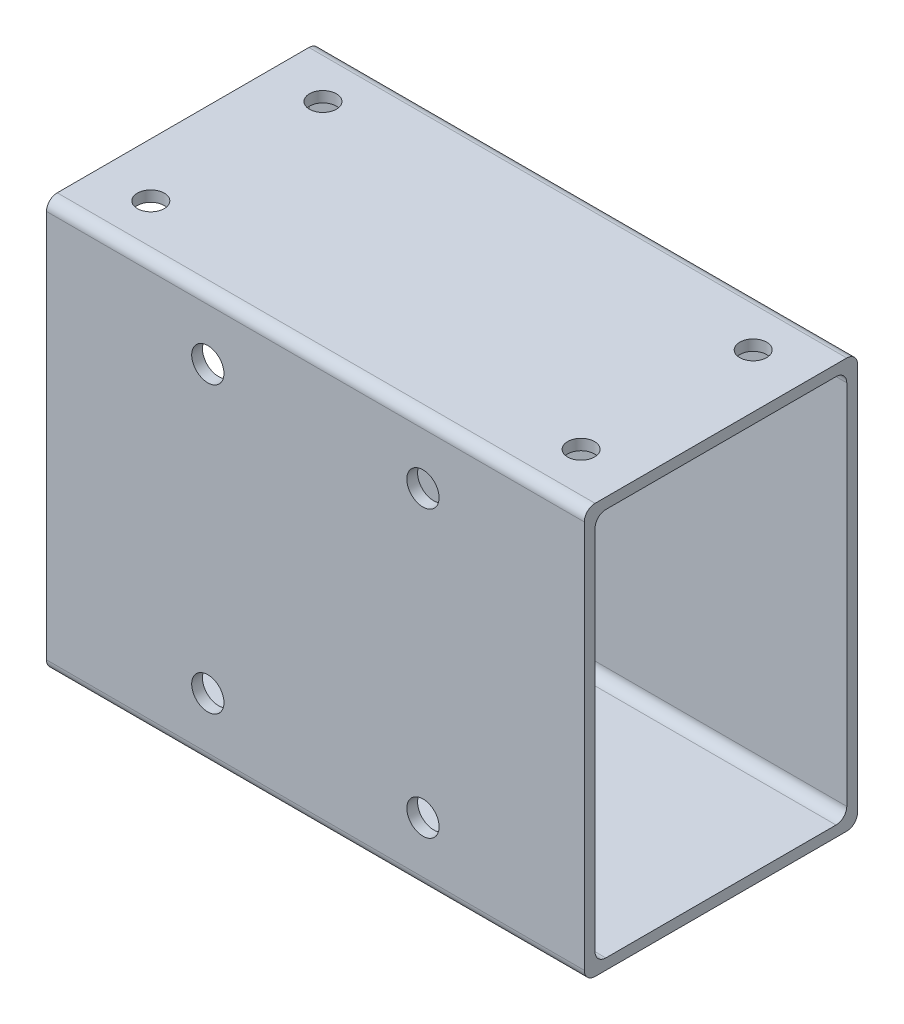
ISO-10303-21;
HEADER;
FILE_DESCRIPTION(('STEP AP214'),'2;1');
FILE_NAME('part.step','',(''),(''),'','','');
FILE_SCHEMA(('AUTOMOTIVE_DESIGN { 1 0 10303 214 1 1 1 1 }'));
ENDSEC;
DATA;
#1=APPLICATION_CONTEXT('core data for automotive mechanical design processes');
#2=APPLICATION_PROTOCOL_DEFINITION('international standard','automotive_design',2000,#1);
#3=PRODUCT_CONTEXT('',#1,'mechanical');
#4=PRODUCT('Part','Part','',(#3));
#5=PRODUCT_RELATED_PRODUCT_CATEGORY('part','',(#4));
#6=PRODUCT_DEFINITION_FORMATION('','',#4);
#7=PRODUCT_DEFINITION_CONTEXT('part definition',#1,'design');
#8=PRODUCT_DEFINITION('design','',#6,#7);
#9=PRODUCT_DEFINITION_SHAPE('','',#8);
#10=(LENGTH_UNIT() NAMED_UNIT(*) SI_UNIT(.MILLI.,.METRE.));
#11=(NAMED_UNIT(*) PLANE_ANGLE_UNIT() SI_UNIT($,.RADIAN.));
#12=(NAMED_UNIT(*) SI_UNIT($,.STERADIAN.) SOLID_ANGLE_UNIT());
#13=UNCERTAINTY_MEASURE_WITH_UNIT(LENGTH_MEASURE(1.E-05),#10,'distance_accuracy_value','');
#14=(GEOMETRIC_REPRESENTATION_CONTEXT(3) GLOBAL_UNCERTAINTY_ASSIGNED_CONTEXT((#13)) GLOBAL_UNIT_ASSIGNED_CONTEXT((#10,
#11,#12)) REPRESENTATION_CONTEXT('',''));
#15=CARTESIAN_POINT('',(0.,0.,0.));
#16=DIRECTION('',(0.,0.,1.));
#17=DIRECTION('',(1.,0.,0.));
#18=AXIS2_PLACEMENT_3D('',#15,#16,#17);
#19=CARTESIAN_POINT('',(-100.,38.1,25.4));
#20=DIRECTION('',(0.,0.,1.));
#21=DIRECTION('',(0.,-1.,0.));
#22=AXIS2_PLACEMENT_3D('',#19,#20,#21);
#23=PLANE('',#22);
#24=CARTESIAN_POINT('',(-30.,-26.5,25.4));
#25=DIRECTION('',(0.,0.,1.));
#26=DIRECTION('',(1.,0.,0.));
#27=AXIS2_PLACEMENT_3D('',#24,#25,#26);
#28=CIRCLE('',#27,3.);
#29=CARTESIAN_POINT('',(-27.,-26.5,25.4));
#30=VERTEX_POINT('',#29);
#31=EDGE_CURVE('E318',#30,#30,#28,.T.);
#32=ORIENTED_EDGE('',*,*,#31,.F.);
#33=EDGE_LOOP('',(#32));
#34=FACE_BOUND('',#33,.T.);
#35=CARTESIAN_POINT('',(-70.,-26.5,25.4));
#36=DIRECTION('',(0.,0.,1.));
#37=DIRECTION('',(1.,0.,0.));
#38=AXIS2_PLACEMENT_3D('',#35,#36,#37);
#39=CIRCLE('',#38,3.00000000000001);
#40=CARTESIAN_POINT('',(-67.,-26.5,25.4));
#41=VERTEX_POINT('',#40);
#42=EDGE_CURVE('E323',#41,#41,#39,.T.);
#43=ORIENTED_EDGE('',*,*,#42,.F.);
#44=EDGE_LOOP('',(#43));
#45=FACE_BOUND('',#44,.T.);
#46=CARTESIAN_POINT('',(-70.,26.5,25.4));
#47=DIRECTION('',(0.,0.,1.));
#48=DIRECTION('',(1.,0.,0.));
#49=AXIS2_PLACEMENT_3D('',#46,#47,#48);
#50=CIRCLE('',#49,3.00000000000001);
#51=CARTESIAN_POINT('',(-67.,26.5,25.4));
#52=VERTEX_POINT('',#51);
#53=EDGE_CURVE('E329',#52,#52,#50,.T.);
#54=ORIENTED_EDGE('',*,*,#53,.F.);
#55=EDGE_LOOP('',(#54));
#56=FACE_BOUND('',#55,.T.);
#57=CARTESIAN_POINT('',(-30.,26.5,25.4));
#58=DIRECTION('',(0.,0.,1.));
#59=DIRECTION('',(1.,0.,0.));
#60=AXIS2_PLACEMENT_3D('',#57,#58,#59);
#61=CIRCLE('',#60,3.);
#62=CARTESIAN_POINT('',(-27.,26.5,25.4));
#63=VERTEX_POINT('',#62);
#64=EDGE_CURVE('E290',#63,#63,#61,.T.);
#65=ORIENTED_EDGE('',*,*,#64,.F.);
#66=EDGE_LOOP('',(#65));
#67=FACE_BOUND('',#66,.T.);
#68=DIRECTION('',(0.,-1.,0.));
#69=VECTOR('',#68,1.);
#70=CARTESIAN_POINT('',(-100.,38.1,25.4));
#71=LINE('',#70,#69);
#72=CARTESIAN_POINT('',(-100.,36.1,25.4));
#73=VERTEX_POINT('',#72);
#74=CARTESIAN_POINT('',(-100.,-36.0999999999999,25.4));
#75=VERTEX_POINT('',#74);
#76=EDGE_CURVE('E367',#73,#75,#71,.T.);
#77=ORIENTED_EDGE('',*,*,#76,.T.);
#78=DIRECTION('',(1.,0.,0.));
#79=VECTOR('',#78,1.);
#80=CARTESIAN_POINT('',(-100.,-36.1,25.4));
#81=LINE('',#80,#79);
#82=CARTESIAN_POINT('',(0.,-36.0999999999999,25.4));
#83=VERTEX_POINT('',#82);
#84=EDGE_CURVE('E228',#75,#83,#81,.T.);
#85=ORIENTED_EDGE('',*,*,#84,.T.);
#86=DIRECTION('',(0.,-1.,0.));
#87=VECTOR('',#86,1.);
#88=CARTESIAN_POINT('',(0.,38.1,25.4));
#89=LINE('',#88,#87);
#90=CARTESIAN_POINT('',(0.,36.1,25.4));
#91=VERTEX_POINT('',#90);
#92=EDGE_CURVE('E166',#91,#83,#89,.T.);
#93=ORIENTED_EDGE('',*,*,#92,.F.);
#94=DIRECTION('',(1.,0.,0.));
#95=VECTOR('',#94,1.);
#96=CARTESIAN_POINT('',(-100.,36.1,25.4));
#97=LINE('',#96,#95);
#98=EDGE_CURVE('E225',#91,#73,#97,.F.);
#99=ORIENTED_EDGE('',*,*,#98,.T.);
#100=EDGE_LOOP('',(#77,#85,#93,#99));
#101=FACE_BOUND('',#100,.T.);
#102=ADVANCED_FACE('F44',(#34,#45,#56,#67,#101),#23,.T.);
#103=CARTESIAN_POINT('',(-100.,38.1,-25.4));
#104=DIRECTION('',(0.,1.,0.));
#105=DIRECTION('',(0.,0.,1.));
#106=AXIS2_PLACEMENT_3D('',#103,#104,#105);
#107=PLANE('',#106);
#108=CARTESIAN_POINT('',(-90.,38.1,16.));
#109=DIRECTION('',(0.,1.,0.));
#110=DIRECTION('',(0.,0.,1.));
#111=AXIS2_PLACEMENT_3D('',#108,#109,#110);
#112=CIRCLE('',#111,2.5);
#113=CARTESIAN_POINT('',(-90.,38.1,18.5));
#114=VERTEX_POINT('',#113);
#115=EDGE_CURVE('E695',#114,#114,#112,.T.);
#116=ORIENTED_EDGE('',*,*,#115,.F.);
#117=EDGE_LOOP('',(#116));
#118=FACE_BOUND('',#117,.T.);
#119=CARTESIAN_POINT('',(-10.,38.1,-16.));
#120=DIRECTION('',(0.,1.,0.));
#121=DIRECTION('',(0.,0.,1.));
#122=AXIS2_PLACEMENT_3D('',#119,#120,#121);
#123=CIRCLE('',#122,2.5);
#124=CARTESIAN_POINT('',(-10.,38.1,-13.5));
#125=VERTEX_POINT('',#124);
#126=EDGE_CURVE('E697',#125,#125,#123,.T.);
#127=ORIENTED_EDGE('',*,*,#126,.F.);
#128=EDGE_LOOP('',(#127));
#129=FACE_BOUND('',#128,.T.);
#130=CARTESIAN_POINT('',(-10.,38.1,16.));
#131=DIRECTION('',(0.,1.,0.));
#132=DIRECTION('',(0.,0.,1.));
#133=AXIS2_PLACEMENT_3D('',#130,#131,#132);
#134=CIRCLE('',#133,2.5);
#135=CARTESIAN_POINT('',(-10.,38.1,18.5));
#136=VERTEX_POINT('',#135);
#137=EDGE_CURVE('E704',#136,#136,#134,.T.);
#138=ORIENTED_EDGE('',*,*,#137,.F.);
#139=EDGE_LOOP('',(#138));
#140=FACE_BOUND('',#139,.T.);
#141=CARTESIAN_POINT('',(-90.,38.1,-16.));
#142=DIRECTION('',(0.,1.,0.));
#143=DIRECTION('',(0.,0.,1.));
#144=AXIS2_PLACEMENT_3D('',#141,#142,#143);
#145=CIRCLE('',#144,2.5);
#146=CARTESIAN_POINT('',(-90.,38.1,-13.5));
#147=VERTEX_POINT('',#146);
#148=EDGE_CURVE('E308',#147,#147,#145,.T.);
#149=ORIENTED_EDGE('',*,*,#148,.F.);
#150=EDGE_LOOP('',(#149));
#151=FACE_BOUND('',#150,.T.);
#152=DIRECTION('',(0.,0.,1.));
#153=VECTOR('',#152,1.);
#154=CARTESIAN_POINT('',(-100.,38.1,-25.4));
#155=LINE('',#154,#153);
#156=CARTESIAN_POINT('',(-100.,38.1,-23.4));
#157=VERTEX_POINT('',#156);
#158=CARTESIAN_POINT('',(-100.,38.1,23.4));
#159=VERTEX_POINT('',#158);
#160=EDGE_CURVE('E190',#157,#159,#155,.T.);
#161=ORIENTED_EDGE('',*,*,#160,.T.);
#162=DIRECTION('',(1.,0.,0.));
#163=VECTOR('',#162,1.);
#164=CARTESIAN_POINT('',(-100.,38.1,23.4));
#165=LINE('',#164,#163);
#166=CARTESIAN_POINT('',(0.,38.1,23.4));
#167=VERTEX_POINT('',#166);
#168=EDGE_CURVE('E233',#159,#167,#165,.T.);
#169=ORIENTED_EDGE('',*,*,#168,.T.);
#170=DIRECTION('',(0.,0.,1.));
#171=VECTOR('',#170,1.);
#172=CARTESIAN_POINT('',(0.,38.1,-25.4));
#173=LINE('',#172,#171);
#174=CARTESIAN_POINT('',(0.,38.1,-23.4));
#175=VERTEX_POINT('',#174);
#176=EDGE_CURVE('E199',#175,#167,#173,.T.);
#177=ORIENTED_EDGE('',*,*,#176,.F.);
#178=DIRECTION('',(1.,0.,0.));
#179=VECTOR('',#178,1.);
#180=CARTESIAN_POINT('',(-100.,38.1,-23.4));
#181=LINE('',#180,#179);
#182=EDGE_CURVE('E69',#175,#157,#181,.F.);
#183=ORIENTED_EDGE('',*,*,#182,.T.);
#184=EDGE_LOOP('',(#161,#169,#177,#183));
#185=FACE_BOUND('',#184,.T.);
#186=ADVANCED_FACE('F383',(#118,#129,#140,#151,#185),#107,.T.);
#187=CARTESIAN_POINT('',(-100.,38.1,-25.4));
#188=DIRECTION('',(0.,0.,-1.));
#189=DIRECTION('',(0.,1.,0.));
#190=AXIS2_PLACEMENT_3D('',#187,#188,#189);
#191=PLANE('',#190);
#192=DIRECTION('',(0.,1.,0.));
#193=VECTOR('',#192,1.);
#194=CARTESIAN_POINT('',(0.,38.1,-25.4));
#195=LINE('',#194,#193);
#196=CARTESIAN_POINT('',(0.,-36.0999999999999,-25.4));
#197=VERTEX_POINT('',#196);
#198=CARTESIAN_POINT('',(0.,36.1,-25.4));
#199=VERTEX_POINT('',#198);
#200=EDGE_CURVE('E184',#197,#199,#195,.T.);
#201=ORIENTED_EDGE('',*,*,#200,.F.);
#202=DIRECTION('',(1.,0.,0.));
#203=VECTOR('',#202,1.);
#204=CARTESIAN_POINT('',(-100.,-36.1,-25.4));
#205=LINE('',#204,#203);
#206=CARTESIAN_POINT('',(-100.,-36.0999999999999,-25.4));
#207=VERTEX_POINT('',#206);
#208=EDGE_CURVE('E212',#197,#207,#205,.F.);
#209=ORIENTED_EDGE('',*,*,#208,.T.);
#210=DIRECTION('',(0.,1.,0.));
#211=VECTOR('',#210,1.);
#212=CARTESIAN_POINT('',(-100.,38.1,-25.4));
#213=LINE('',#212,#211);
#214=CARTESIAN_POINT('',(-100.,36.1,-25.4));
#215=VERTEX_POINT('',#214);
#216=EDGE_CURVE('E196',#207,#215,#213,.T.);
#217=ORIENTED_EDGE('',*,*,#216,.T.);
#218=DIRECTION('',(1.,0.,0.));
#219=VECTOR('',#218,1.);
#220=CARTESIAN_POINT('',(-100.,36.1,-25.4));
#221=LINE('',#220,#219);
#222=EDGE_CURVE('E208',#215,#199,#221,.T.);
#223=ORIENTED_EDGE('',*,*,#222,.T.);
#224=EDGE_LOOP('',(#201,#209,#217,#223));
#225=FACE_BOUND('',#224,.T.);
#226=ADVANCED_FACE('F393',(#225),#191,.T.);
#227=CARTESIAN_POINT('',(-100.,-38.1,-25.4));
#228=DIRECTION('',(0.,-1.,0.));
#229=DIRECTION('',(0.,0.,-1.));
#230=AXIS2_PLACEMENT_3D('',#227,#228,#229);
#231=PLANE('',#230);
#232=DIRECTION('',(0.,0.,-1.));
#233=VECTOR('',#232,1.);
#234=CARTESIAN_POINT('',(-100.,-38.1,-25.4));
#235=LINE('',#234,#233);
#236=CARTESIAN_POINT('',(-100.,-38.1,23.4));
#237=VERTEX_POINT('',#236);
#238=CARTESIAN_POINT('',(-100.,-38.1,-23.4));
#239=VERTEX_POINT('',#238);
#240=EDGE_CURVE('E371',#237,#239,#235,.T.);
#241=ORIENTED_EDGE('',*,*,#240,.T.);
#242=DIRECTION('',(1.,0.,0.));
#243=VECTOR('',#242,1.);
#244=CARTESIAN_POINT('',(-100.,-38.1,-23.4));
#245=LINE('',#244,#243);
#246=CARTESIAN_POINT('',(0.,-38.1,-23.4));
#247=VERTEX_POINT('',#246);
#248=EDGE_CURVE('E182',#239,#247,#245,.T.);
#249=ORIENTED_EDGE('',*,*,#248,.T.);
#250=DIRECTION('',(0.,0.,-1.));
#251=VECTOR('',#250,1.);
#252=CARTESIAN_POINT('',(0.,-38.1,-25.4));
#253=LINE('',#252,#251);
#254=CARTESIAN_POINT('',(0.,-38.1,23.4));
#255=VERTEX_POINT('',#254);
#256=EDGE_CURVE('E164',#255,#247,#253,.T.);
#257=ORIENTED_EDGE('',*,*,#256,.F.);
#258=DIRECTION('',(1.,0.,0.));
#259=VECTOR('',#258,1.);
#260=CARTESIAN_POINT('',(-100.,-38.1,23.4));
#261=LINE('',#260,#259);
#262=EDGE_CURVE('E179',#255,#237,#261,.F.);
#263=ORIENTED_EDGE('',*,*,#262,.T.);
#264=EDGE_LOOP('',(#241,#249,#257,#263));
#265=FACE_BOUND('',#264,.T.);
#266=ADVANCED_FACE('F178',(#265),#231,.T.);
#267=CARTESIAN_POINT('',(-100.,0.,0.));
#268=DIRECTION('',(-1.,0.,0.));
#269=DIRECTION('',(0.,0.,1.));
#270=AXIS2_PLACEMENT_3D('',#267,#268,#269);
#271=PLANE('',#270);
#272=DIRECTION('',(0.,0.,1.));
#273=VECTOR('',#272,1.);
#274=CARTESIAN_POINT('',(-100.,36.1,-23.4));
#275=LINE('',#274,#273);
#276=CARTESIAN_POINT('',(-100.,36.1,-21.4));
#277=VERTEX_POINT('',#276);
#278=CARTESIAN_POINT('',(-100.,36.1,21.4));
#279=VERTEX_POINT('',#278);
#280=EDGE_CURVE('E349',#277,#279,#275,.T.);
#281=ORIENTED_EDGE('',*,*,#280,.T.);
#282=CARTESIAN_POINT('',(-100.,34.1,21.4));
#283=DIRECTION('',(-1.,0.,0.));
#284=DIRECTION('',(0.,0.,1.));
#285=AXIS2_PLACEMENT_3D('',#282,#283,#284);
#286=CIRCLE('',#285,2.);
#287=CARTESIAN_POINT('',(-100.,34.1,23.4));
#288=VERTEX_POINT('',#287);
#289=EDGE_CURVE('E11',#279,#288,#286,.F.);
#290=ORIENTED_EDGE('',*,*,#289,.T.);
#291=DIRECTION('',(0.,-1.,0.));
#292=VECTOR('',#291,1.);
#293=CARTESIAN_POINT('',(-100.,36.1,23.4));
#294=LINE('',#293,#292);
#295=CARTESIAN_POINT('',(-100.,-34.1,23.4));
#296=VERTEX_POINT('',#295);
#297=EDGE_CURVE('E336',#288,#296,#294,.T.);
#298=ORIENTED_EDGE('',*,*,#297,.T.);
#299=CARTESIAN_POINT('',(-100.,-34.1,21.4));
#300=DIRECTION('',(-1.,0.,0.));
#301=DIRECTION('',(0.,0.,1.));
#302=AXIS2_PLACEMENT_3D('',#299,#300,#301);
#303=CIRCLE('',#302,2.);
#304=CARTESIAN_POINT('',(-100.,-36.1,21.4));
#305=VERTEX_POINT('',#304);
#306=EDGE_CURVE('E280',#296,#305,#303,.F.);
#307=ORIENTED_EDGE('',*,*,#306,.T.);
#308=DIRECTION('',(0.,0.,-1.));
#309=VECTOR('',#308,1.);
#310=CARTESIAN_POINT('',(-100.,-36.1,-23.4));
#311=LINE('',#310,#309);
#312=CARTESIAN_POINT('',(-100.,-36.1,-21.4));
#313=VERTEX_POINT('',#312);
#314=EDGE_CURVE('E340',#305,#313,#311,.T.);
#315=ORIENTED_EDGE('',*,*,#314,.T.);
#316=CARTESIAN_POINT('',(-100.,-34.1,-21.4));
#317=DIRECTION('',(-1.,0.,0.));
#318=DIRECTION('',(0.,0.,1.));
#319=AXIS2_PLACEMENT_3D('',#316,#317,#318);
#320=CIRCLE('',#319,2.);
#321=CARTESIAN_POINT('',(-100.,-34.1,-23.4));
#322=VERTEX_POINT('',#321);
#323=EDGE_CURVE('E268',#313,#322,#320,.F.);
#324=ORIENTED_EDGE('',*,*,#323,.T.);
#325=DIRECTION('',(0.,1.,0.));
#326=VECTOR('',#325,1.);
#327=CARTESIAN_POINT('',(-100.,36.1,-23.4));
#328=LINE('',#327,#326);
#329=CARTESIAN_POINT('',(-100.,34.1,-23.4));
#330=VERTEX_POINT('',#329);
#331=EDGE_CURVE('E345',#322,#330,#328,.T.);
#332=ORIENTED_EDGE('',*,*,#331,.T.);
#333=CARTESIAN_POINT('',(-100.,34.1,-21.4));
#334=DIRECTION('',(-1.,0.,0.));
#335=DIRECTION('',(0.,0.,1.));
#336=AXIS2_PLACEMENT_3D('',#333,#334,#335);
#337=CIRCLE('',#336,2.);
#338=EDGE_CURVE('E274',#330,#277,#337,.F.);
#339=ORIENTED_EDGE('',*,*,#338,.T.);
#340=EDGE_LOOP('',(#281,#290,#298,#307,#315,#324,#332,#339));
#341=FACE_BOUND('',#340,.T.);
#342=ORIENTED_EDGE('',*,*,#216,.F.);
#343=CARTESIAN_POINT('',(-100.,-36.1,-23.4));
#344=DIRECTION('',(-1.,0.,0.));
#345=DIRECTION('',(0.,0.,1.));
#346=AXIS2_PLACEMENT_3D('',#343,#344,#345);
#347=CIRCLE('',#346,2.);
#348=EDGE_CURVE('E222',#207,#239,#347,.T.);
#349=ORIENTED_EDGE('',*,*,#348,.T.);
#350=ORIENTED_EDGE('',*,*,#240,.F.);
#351=CARTESIAN_POINT('',(-100.,-36.1,23.4));
#352=DIRECTION('',(-1.,0.,0.));
#353=DIRECTION('',(0.,0.,1.));
#354=AXIS2_PLACEMENT_3D('',#351,#352,#353);
#355=CIRCLE('',#354,2.);
#356=EDGE_CURVE('E188',#237,#75,#355,.T.);
#357=ORIENTED_EDGE('',*,*,#356,.T.);
#358=ORIENTED_EDGE('',*,*,#76,.F.);
#359=CARTESIAN_POINT('',(-100.,36.1,23.4));
#360=DIRECTION('',(-1.,0.,0.));
#361=DIRECTION('',(0.,0.,1.));
#362=AXIS2_PLACEMENT_3D('',#359,#360,#361);
#363=CIRCLE('',#362,2.);
#364=EDGE_CURVE('E62',#73,#159,#363,.T.);
#365=ORIENTED_EDGE('',*,*,#364,.T.);
#366=ORIENTED_EDGE('',*,*,#160,.F.);
#367=CARTESIAN_POINT('',(-100.,36.1,-23.4));
#368=DIRECTION('',(-1.,0.,0.));
#369=DIRECTION('',(0.,0.,1.));
#370=AXIS2_PLACEMENT_3D('',#367,#368,#369);
#371=CIRCLE('',#370,2.);
#372=EDGE_CURVE('E215',#157,#215,#371,.T.);
#373=ORIENTED_EDGE('',*,*,#372,.T.);
#374=EDGE_LOOP('',(#342,#349,#350,#357,#358,#365,#366,#373));
#375=FACE_BOUND('',#374,.T.);
#376=ADVANCED_FACE('F390',(#341,#375),#271,.T.);
#377=CARTESIAN_POINT('',(0.,0.,0.));
#378=DIRECTION('',(-1.,0.,0.));
#379=DIRECTION('',(0.,0.,1.));
#380=AXIS2_PLACEMENT_3D('',#377,#378,#379);
#381=PLANE('',#380);
#382=DIRECTION('',(0.,0.,-1.));
#383=VECTOR('',#382,1.);
#384=CARTESIAN_POINT('',(0.,-36.1,-23.4));
#385=LINE('',#384,#383);
#386=CARTESIAN_POINT('',(0.,-36.1,21.4));
#387=VERTEX_POINT('',#386);
#388=CARTESIAN_POINT('',(0.,-36.1,-21.4));
#389=VERTEX_POINT('',#388);
#390=EDGE_CURVE('E356',#387,#389,#385,.T.);
#391=ORIENTED_EDGE('',*,*,#390,.F.);
#392=CARTESIAN_POINT('',(0.,-34.1,21.4));
#393=DIRECTION('',(-1.,0.,0.));
#394=DIRECTION('',(0.,0.,1.));
#395=AXIS2_PLACEMENT_3D('',#392,#393,#394);
#396=CIRCLE('',#395,2.);
#397=CARTESIAN_POINT('',(0.,-34.1,23.4));
#398=VERTEX_POINT('',#397);
#399=EDGE_CURVE('E277',#387,#398,#396,.T.);
#400=ORIENTED_EDGE('',*,*,#399,.T.);
#401=DIRECTION('',(0.,-1.,0.));
#402=VECTOR('',#401,1.);
#403=CARTESIAN_POINT('',(0.,36.1,23.4));
#404=LINE('',#403,#402);
#405=CARTESIAN_POINT('',(0.,34.1,23.4));
#406=VERTEX_POINT('',#405);
#407=EDGE_CURVE('E302',#406,#398,#404,.T.);
#408=ORIENTED_EDGE('',*,*,#407,.F.);
#409=CARTESIAN_POINT('',(0.,34.1,21.4));
#410=DIRECTION('',(-1.,0.,0.));
#411=DIRECTION('',(0.,0.,1.));
#412=AXIS2_PLACEMENT_3D('',#409,#410,#411);
#413=CIRCLE('',#412,2.);
#414=CARTESIAN_POINT('',(0.,36.1,21.4));
#415=VERTEX_POINT('',#414);
#416=EDGE_CURVE('E54',#406,#415,#413,.T.);
#417=ORIENTED_EDGE('',*,*,#416,.T.);
#418=DIRECTION('',(0.,0.,1.));
#419=VECTOR('',#418,1.);
#420=CARTESIAN_POINT('',(0.,36.1,-23.4));
#421=LINE('',#420,#419);
#422=CARTESIAN_POINT('',(0.,36.1,-21.4));
#423=VERTEX_POINT('',#422);
#424=EDGE_CURVE('E341',#423,#415,#421,.T.);
#425=ORIENTED_EDGE('',*,*,#424,.F.);
#426=CARTESIAN_POINT('',(0.,34.1,-21.4));
#427=DIRECTION('',(-1.,0.,0.));
#428=DIRECTION('',(0.,0.,1.));
#429=AXIS2_PLACEMENT_3D('',#426,#427,#428);
#430=CIRCLE('',#429,2.);
#431=CARTESIAN_POINT('',(0.,34.1,-23.4));
#432=VERTEX_POINT('',#431);
#433=EDGE_CURVE('E271',#423,#432,#430,.T.);
#434=ORIENTED_EDGE('',*,*,#433,.T.);
#435=DIRECTION('',(0.,1.,0.));
#436=VECTOR('',#435,1.);
#437=CARTESIAN_POINT('',(0.,36.1,-23.4));
#438=LINE('',#437,#436);
#439=CARTESIAN_POINT('',(0.,-34.1,-23.4));
#440=VERTEX_POINT('',#439);
#441=EDGE_CURVE('E360',#440,#432,#438,.T.);
#442=ORIENTED_EDGE('',*,*,#441,.F.);
#443=CARTESIAN_POINT('',(0.,-34.1,-21.4));
#444=DIRECTION('',(-1.,0.,0.));
#445=DIRECTION('',(0.,0.,1.));
#446=AXIS2_PLACEMENT_3D('',#443,#444,#445);
#447=CIRCLE('',#446,2.);
#448=EDGE_CURVE('E265',#440,#389,#447,.T.);
#449=ORIENTED_EDGE('',*,*,#448,.T.);
#450=EDGE_LOOP('',(#391,#400,#408,#417,#425,#434,#442,#449));
#451=FACE_BOUND('',#450,.T.);
#452=ORIENTED_EDGE('',*,*,#256,.T.);
#453=CARTESIAN_POINT('',(0.,-36.1,-23.4));
#454=DIRECTION('',(-1.,0.,0.));
#455=DIRECTION('',(0.,0.,1.));
#456=AXIS2_PLACEMENT_3D('',#453,#454,#455);
#457=CIRCLE('',#456,2.);
#458=EDGE_CURVE('E172',#247,#197,#457,.F.);
#459=ORIENTED_EDGE('',*,*,#458,.T.);
#460=ORIENTED_EDGE('',*,*,#200,.T.);
#461=CARTESIAN_POINT('',(0.,36.1,-23.4));
#462=DIRECTION('',(-1.,0.,0.));
#463=DIRECTION('',(0.,0.,1.));
#464=AXIS2_PLACEMENT_3D('',#461,#462,#463);
#465=CIRCLE('',#464,2.);
#466=EDGE_CURVE('E194',#199,#175,#465,.F.);
#467=ORIENTED_EDGE('',*,*,#466,.T.);
#468=ORIENTED_EDGE('',*,*,#176,.T.);
#469=CARTESIAN_POINT('',(0.,36.1,23.4));
#470=DIRECTION('',(-1.,0.,0.));
#471=DIRECTION('',(0.,0.,1.));
#472=AXIS2_PLACEMENT_3D('',#469,#470,#471);
#473=CIRCLE('',#472,2.);
#474=EDGE_CURVE('E173',#167,#91,#473,.F.);
#475=ORIENTED_EDGE('',*,*,#474,.T.);
#476=ORIENTED_EDGE('',*,*,#92,.T.);
#477=CARTESIAN_POINT('',(0.,-36.1,23.4));
#478=DIRECTION('',(-1.,0.,0.));
#479=DIRECTION('',(0.,0.,1.));
#480=AXIS2_PLACEMENT_3D('',#477,#478,#479);
#481=CIRCLE('',#480,2.);
#482=EDGE_CURVE('E161',#83,#255,#481,.F.);
#483=ORIENTED_EDGE('',*,*,#482,.T.);
#484=EDGE_LOOP('',(#452,#459,#460,#467,#468,#475,#476,#483));
#485=FACE_BOUND('',#484,.T.);
#486=ADVANCED_FACE('F163',(#451,#485),#381,.F.);
#487=CARTESIAN_POINT('',(-100.,36.1,23.4));
#488=DIRECTION('',(0.,0.,1.));
#489=DIRECTION('',(1.,0.,0.));
#490=AXIS2_PLACEMENT_3D('',#487,#488,#489);
#491=PLANE('',#490);
#492=CARTESIAN_POINT('',(-30.,-26.5,23.4));
#493=DIRECTION('',(0.,0.,1.));
#494=DIRECTION('',(1.,0.,0.));
#495=AXIS2_PLACEMENT_3D('',#492,#493,#494);
#496=CIRCLE('',#495,3.);
#497=CARTESIAN_POINT('',(-27.,-26.5,23.4));
#498=VERTEX_POINT('',#497);
#499=EDGE_CURVE('E298',#498,#498,#496,.T.);
#500=ORIENTED_EDGE('',*,*,#499,.T.);
#501=EDGE_LOOP('',(#500));
#502=FACE_BOUND('',#501,.T.);
#503=CARTESIAN_POINT('',(-70.,-26.5,23.4));
#504=DIRECTION('',(0.,0.,1.));
#505=DIRECTION('',(1.,0.,0.));
#506=AXIS2_PLACEMENT_3D('',#503,#504,#505);
#507=CIRCLE('',#506,3.00000000000001);
#508=CARTESIAN_POINT('',(-67.,-26.5,23.4));
#509=VERTEX_POINT('',#508);
#510=EDGE_CURVE('E294',#509,#509,#507,.T.);
#511=ORIENTED_EDGE('',*,*,#510,.T.);
#512=EDGE_LOOP('',(#511));
#513=FACE_BOUND('',#512,.T.);
#514=CARTESIAN_POINT('',(-70.,26.5,23.4));
#515=DIRECTION('',(0.,0.,1.));
#516=DIRECTION('',(1.,0.,0.));
#517=AXIS2_PLACEMENT_3D('',#514,#515,#516);
#518=CIRCLE('',#517,3.00000000000001);
#519=CARTESIAN_POINT('',(-67.,26.5,23.4));
#520=VERTEX_POINT('',#519);
#521=EDGE_CURVE('E289',#520,#520,#518,.T.);
#522=ORIENTED_EDGE('',*,*,#521,.T.);
#523=EDGE_LOOP('',(#522));
#524=FACE_BOUND('',#523,.T.);
#525=CARTESIAN_POINT('',(-30.,26.5,23.4));
#526=DIRECTION('',(0.,0.,1.));
#527=DIRECTION('',(1.,0.,0.));
#528=AXIS2_PLACEMENT_3D('',#525,#526,#527);
#529=CIRCLE('',#528,3.);
#530=CARTESIAN_POINT('',(-27.,26.5,23.4));
#531=VERTEX_POINT('',#530);
#532=EDGE_CURVE('E285',#531,#531,#529,.T.);
#533=ORIENTED_EDGE('',*,*,#532,.T.);
#534=EDGE_LOOP('',(#533));
#535=FACE_BOUND('',#534,.T.);
#536=ORIENTED_EDGE('',*,*,#407,.T.);
#537=DIRECTION('',(1.,0.,0.));
#538=VECTOR('',#537,1.);
#539=CARTESIAN_POINT('',(-100.,-34.1,23.4));
#540=LINE('',#539,#538);
#541=EDGE_CURVE('E262',#398,#296,#540,.F.);
#542=ORIENTED_EDGE('',*,*,#541,.T.);
#543=ORIENTED_EDGE('',*,*,#297,.F.);
#544=DIRECTION('',(1.,0.,0.));
#545=VECTOR('',#544,1.);
#546=CARTESIAN_POINT('',(0.,34.1,23.4));
#547=LINE('',#546,#545);
#548=EDGE_CURVE('E258',#288,#406,#547,.T.);
#549=ORIENTED_EDGE('',*,*,#548,.T.);
#550=EDGE_LOOP('',(#536,#542,#543,#549));
#551=FACE_BOUND('',#550,.T.);
#552=ADVANCED_FACE('F438',(#502,#513,#524,#535,#551),#491,.F.);
#553=CARTESIAN_POINT('',(-100.,36.1,-23.4));
#554=DIRECTION('',(0.,1.,0.));
#555=DIRECTION('',(0.,0.,1.));
#556=AXIS2_PLACEMENT_3D('',#553,#554,#555);
#557=PLANE('',#556);
#558=CARTESIAN_POINT('',(-90.,36.1,16.));
#559=DIRECTION('',(0.,1.,0.));
#560=DIRECTION('',(0.,0.,1.));
#561=AXIS2_PLACEMENT_3D('',#558,#559,#560);
#562=CIRCLE('',#561,2.5);
#563=CARTESIAN_POINT('',(-90.,36.1,18.5));
#564=VERTEX_POINT('',#563);
#565=EDGE_CURVE('E48',#564,#564,#562,.T.);
#566=ORIENTED_EDGE('',*,*,#565,.T.);
#567=EDGE_LOOP('',(#566));
#568=FACE_BOUND('',#567,.T.);
#569=CARTESIAN_POINT('',(-10.,36.1,-16.));
#570=DIRECTION('',(0.,1.,0.));
#571=DIRECTION('',(0.,0.,1.));
#572=AXIS2_PLACEMENT_3D('',#569,#570,#571);
#573=CIRCLE('',#572,2.5);
#574=CARTESIAN_POINT('',(-10.,36.1,-13.5));
#575=VERTEX_POINT('',#574);
#576=EDGE_CURVE('E311',#575,#575,#573,.T.);
#577=ORIENTED_EDGE('',*,*,#576,.T.);
#578=EDGE_LOOP('',(#577));
#579=FACE_BOUND('',#578,.T.);
#580=CARTESIAN_POINT('',(-10.,36.1,16.));
#581=DIRECTION('',(0.,1.,0.));
#582=DIRECTION('',(0.,0.,1.));
#583=AXIS2_PLACEMENT_3D('',#580,#581,#582);
#584=CIRCLE('',#583,2.5);
#585=CARTESIAN_POINT('',(-10.,36.1,18.5));
#586=VERTEX_POINT('',#585);
#587=EDGE_CURVE('E307',#586,#586,#584,.T.);
#588=ORIENTED_EDGE('',*,*,#587,.T.);
#589=EDGE_LOOP('',(#588));
#590=FACE_BOUND('',#589,.T.);
#591=CARTESIAN_POINT('',(-90.,36.1,-16.));
#592=DIRECTION('',(0.,1.,0.));
#593=DIRECTION('',(0.,0.,1.));
#594=AXIS2_PLACEMENT_3D('',#591,#592,#593);
#595=CIRCLE('',#594,2.5);
#596=CARTESIAN_POINT('',(-90.,36.1,-13.5));
#597=VERTEX_POINT('',#596);
#598=EDGE_CURVE('E303',#597,#597,#595,.T.);
#599=ORIENTED_EDGE('',*,*,#598,.T.);
#600=EDGE_LOOP('',(#599));
#601=FACE_BOUND('',#600,.T.);
#602=ORIENTED_EDGE('',*,*,#280,.F.);
#603=DIRECTION('',(1.,0.,0.));
#604=VECTOR('',#603,1.);
#605=CARTESIAN_POINT('',(0.,36.1,-21.4));
#606=LINE('',#605,#604);
#607=EDGE_CURVE('E254',#277,#423,#606,.T.);
#608=ORIENTED_EDGE('',*,*,#607,.T.);
#609=ORIENTED_EDGE('',*,*,#424,.T.);
#610=DIRECTION('',(1.,0.,0.));
#611=VECTOR('',#610,1.);
#612=CARTESIAN_POINT('',(-100.,36.1,21.4));
#613=LINE('',#612,#611);
#614=EDGE_CURVE('E251',#415,#279,#613,.F.);
#615=ORIENTED_EDGE('',*,*,#614,.T.);
#616=EDGE_LOOP('',(#602,#608,#609,#615));
#617=FACE_BOUND('',#616,.T.);
#618=ADVANCED_FACE('F433',(#568,#579,#590,#601,#617),#557,.F.);
#619=CARTESIAN_POINT('',(-100.,36.1,-23.4));
#620=DIRECTION('',(0.,0.,-1.));
#621=DIRECTION('',(-1.,0.,0.));
#622=AXIS2_PLACEMENT_3D('',#619,#620,#621);
#623=PLANE('',#622);
#624=ORIENTED_EDGE('',*,*,#331,.F.);
#625=DIRECTION('',(1.,0.,0.));
#626=VECTOR('',#625,1.);
#627=CARTESIAN_POINT('',(0.,-34.1,-23.4));
#628=LINE('',#627,#626);
#629=EDGE_CURVE('E240',#322,#440,#628,.T.);
#630=ORIENTED_EDGE('',*,*,#629,.T.);
#631=ORIENTED_EDGE('',*,*,#441,.T.);
#632=DIRECTION('',(1.,0.,0.));
#633=VECTOR('',#632,1.);
#634=CARTESIAN_POINT('',(-100.,34.1,-23.4));
#635=LINE('',#634,#633);
#636=EDGE_CURVE('E237',#432,#330,#635,.F.);
#637=ORIENTED_EDGE('',*,*,#636,.T.);
#638=EDGE_LOOP('',(#624,#630,#631,#637));
#639=FACE_BOUND('',#638,.T.);
#640=ADVANCED_FACE('F427',(#639),#623,.F.);
#641=CARTESIAN_POINT('',(-100.,-36.1,-23.4));
#642=DIRECTION('',(0.,-1.,0.));
#643=DIRECTION('',(0.,0.,-1.));
#644=AXIS2_PLACEMENT_3D('',#641,#642,#643);
#645=PLANE('',#644);
#646=ORIENTED_EDGE('',*,*,#390,.T.);
#647=DIRECTION('',(1.,0.,0.));
#648=VECTOR('',#647,1.);
#649=CARTESIAN_POINT('',(-100.,-36.1,-21.4));
#650=LINE('',#649,#648);
#651=EDGE_CURVE('E248',#389,#313,#650,.F.);
#652=ORIENTED_EDGE('',*,*,#651,.T.);
#653=ORIENTED_EDGE('',*,*,#314,.F.);
#654=DIRECTION('',(1.,0.,0.));
#655=VECTOR('',#654,1.);
#656=CARTESIAN_POINT('',(0.,-36.1,21.4));
#657=LINE('',#656,#655);
#658=EDGE_CURVE('E244',#305,#387,#657,.T.);
#659=ORIENTED_EDGE('',*,*,#658,.T.);
#660=EDGE_LOOP('',(#646,#652,#653,#659));
#661=FACE_BOUND('',#660,.T.);
#662=ADVANCED_FACE('F423',(#661),#645,.F.);
#663=CARTESIAN_POINT('',(-100.,-36.1,-23.4));
#664=DIRECTION('',(1.,0.,0.));
#665=DIRECTION('',(0.,0.,-1.));
#666=AXIS2_PLACEMENT_3D('',#663,#664,#665);
#667=CYLINDRICAL_SURFACE('',#666,2.);
#668=ORIENTED_EDGE('',*,*,#348,.F.);
#669=ORIENTED_EDGE('',*,*,#208,.F.);
#670=ORIENTED_EDGE('',*,*,#458,.F.);
#671=ORIENTED_EDGE('',*,*,#248,.F.);
#672=EDGE_LOOP('',(#668,#669,#670,#671));
#673=FACE_BOUND('',#672,.T.);
#674=ADVANCED_FACE('F396',(#673),#667,.T.);
#675=CARTESIAN_POINT('',(-100.,-36.1,23.4));
#676=DIRECTION('',(1.,0.,0.));
#677=DIRECTION('',(0.,0.,-1.));
#678=AXIS2_PLACEMENT_3D('',#675,#676,#677);
#679=CYLINDRICAL_SURFACE('',#678,2.);
#680=ORIENTED_EDGE('',*,*,#356,.F.);
#681=ORIENTED_EDGE('',*,*,#262,.F.);
#682=ORIENTED_EDGE('',*,*,#482,.F.);
#683=ORIENTED_EDGE('',*,*,#84,.F.);
#684=EDGE_LOOP('',(#680,#681,#682,#683));
#685=FACE_BOUND('',#684,.T.);
#686=ADVANCED_FACE('F187',(#685),#679,.T.);
#687=CARTESIAN_POINT('',(-100.,36.1,23.4));
#688=DIRECTION('',(1.,0.,0.));
#689=DIRECTION('',(0.,0.,-1.));
#690=AXIS2_PLACEMENT_3D('',#687,#688,#689);
#691=CYLINDRICAL_SURFACE('',#690,2.);
#692=ORIENTED_EDGE('',*,*,#364,.F.);
#693=ORIENTED_EDGE('',*,*,#98,.F.);
#694=ORIENTED_EDGE('',*,*,#474,.F.);
#695=ORIENTED_EDGE('',*,*,#168,.F.);
#696=EDGE_LOOP('',(#692,#693,#694,#695));
#697=FACE_BOUND('',#696,.T.);
#698=ADVANCED_FACE('F400',(#697),#691,.T.);
#699=CARTESIAN_POINT('',(-100.,36.1,-23.4));
#700=DIRECTION('',(1.,0.,0.));
#701=DIRECTION('',(0.,0.,-1.));
#702=AXIS2_PLACEMENT_3D('',#699,#700,#701);
#703=CYLINDRICAL_SURFACE('',#702,2.);
#704=ORIENTED_EDGE('',*,*,#372,.F.);
#705=ORIENTED_EDGE('',*,*,#182,.F.);
#706=ORIENTED_EDGE('',*,*,#466,.F.);
#707=ORIENTED_EDGE('',*,*,#222,.F.);
#708=EDGE_LOOP('',(#704,#705,#706,#707));
#709=FACE_BOUND('',#708,.T.);
#710=ADVANCED_FACE('F387',(#709),#703,.T.);
#711=CARTESIAN_POINT('',(-100.,-34.1,-21.4));
#712=DIRECTION('',(-1.,0.,0.));
#713=DIRECTION('',(0.,0.,1.));
#714=AXIS2_PLACEMENT_3D('',#711,#712,#713);
#715=CYLINDRICAL_SURFACE('',#714,2.);
#716=ORIENTED_EDGE('',*,*,#323,.F.);
#717=ORIENTED_EDGE('',*,*,#651,.F.);
#718=ORIENTED_EDGE('',*,*,#448,.F.);
#719=ORIENTED_EDGE('',*,*,#629,.F.);
#720=EDGE_LOOP('',(#716,#717,#718,#719));
#721=FACE_BOUND('',#720,.T.);
#722=ADVANCED_FACE('F407',(#721),#715,.F.);
#723=CARTESIAN_POINT('',(-100.,34.1,-21.4));
#724=DIRECTION('',(-1.,0.,0.));
#725=DIRECTION('',(0.,0.,1.));
#726=AXIS2_PLACEMENT_3D('',#723,#724,#725);
#727=CYLINDRICAL_SURFACE('',#726,2.);
#728=ORIENTED_EDGE('',*,*,#338,.F.);
#729=ORIENTED_EDGE('',*,*,#636,.F.);
#730=ORIENTED_EDGE('',*,*,#433,.F.);
#731=ORIENTED_EDGE('',*,*,#607,.F.);
#732=EDGE_LOOP('',(#728,#729,#730,#731));
#733=FACE_BOUND('',#732,.T.);
#734=ADVANCED_FACE('F516',(#733),#727,.F.);
#735=CARTESIAN_POINT('',(-100.,-34.1,21.4));
#736=DIRECTION('',(-1.,0.,0.));
#737=DIRECTION('',(0.,0.,1.));
#738=AXIS2_PLACEMENT_3D('',#735,#736,#737);
#739=CYLINDRICAL_SURFACE('',#738,2.);
#740=ORIENTED_EDGE('',*,*,#306,.F.);
#741=ORIENTED_EDGE('',*,*,#541,.F.);
#742=ORIENTED_EDGE('',*,*,#399,.F.);
#743=ORIENTED_EDGE('',*,*,#658,.F.);
#744=EDGE_LOOP('',(#740,#741,#742,#743));
#745=FACE_BOUND('',#744,.T.);
#746=ADVANCED_FACE('F527',(#745),#739,.F.);
#747=CARTESIAN_POINT('',(-100.,34.1,21.4));
#748=DIRECTION('',(-1.,0.,0.));
#749=DIRECTION('',(0.,0.,1.));
#750=AXIS2_PLACEMENT_3D('',#747,#748,#749);
#751=CYLINDRICAL_SURFACE('',#750,2.);
#752=ORIENTED_EDGE('',*,*,#289,.F.);
#753=ORIENTED_EDGE('',*,*,#614,.F.);
#754=ORIENTED_EDGE('',*,*,#416,.F.);
#755=ORIENTED_EDGE('',*,*,#548,.F.);
#756=EDGE_LOOP('',(#752,#753,#754,#755));
#757=FACE_BOUND('',#756,.T.);
#758=ADVANCED_FACE('F46',(#757),#751,.F.);
#759=CARTESIAN_POINT('',(-30.,26.5,15.4));
#760=DIRECTION('',(0.,0.,1.));
#761=DIRECTION('',(1.,0.,0.));
#762=AXIS2_PLACEMENT_3D('',#759,#760,#761);
#763=CYLINDRICAL_SURFACE('',#762,3.);
#764=ORIENTED_EDGE('',*,*,#64,.T.);
#765=EDGE_LOOP('',(#764));
#766=FACE_BOUND('',#765,.T.);
#767=ORIENTED_EDGE('',*,*,#532,.F.);
#768=EDGE_LOOP('',(#767));
#769=FACE_BOUND('',#768,.T.);
#770=ADVANCED_FACE('F546',(#766,#769),#763,.F.);
#771=CARTESIAN_POINT('',(-70.,26.5,15.4));
#772=DIRECTION('',(0.,0.,1.));
#773=DIRECTION('',(1.,0.,0.));
#774=AXIS2_PLACEMENT_3D('',#771,#772,#773);
#775=CYLINDRICAL_SURFACE('',#774,3.00000000000001);
#776=ORIENTED_EDGE('',*,*,#53,.T.);
#777=EDGE_LOOP('',(#776));
#778=FACE_BOUND('',#777,.T.);
#779=ORIENTED_EDGE('',*,*,#521,.F.);
#780=EDGE_LOOP('',(#779));
#781=FACE_BOUND('',#780,.T.);
#782=ADVANCED_FACE('F606',(#778,#781),#775,.F.);
#783=CARTESIAN_POINT('',(-70.,-26.5,15.4));
#784=DIRECTION('',(0.,0.,1.));
#785=DIRECTION('',(1.,0.,0.));
#786=AXIS2_PLACEMENT_3D('',#783,#784,#785);
#787=CYLINDRICAL_SURFACE('',#786,3.00000000000001);
#788=ORIENTED_EDGE('',*,*,#42,.T.);
#789=EDGE_LOOP('',(#788));
#790=FACE_BOUND('',#789,.T.);
#791=ORIENTED_EDGE('',*,*,#510,.F.);
#792=EDGE_LOOP('',(#791));
#793=FACE_BOUND('',#792,.T.);
#794=ADVANCED_FACE('F615',(#790,#793),#787,.F.);
#795=CARTESIAN_POINT('',(-30.,-26.5,15.4));
#796=DIRECTION('',(0.,0.,1.));
#797=DIRECTION('',(1.,0.,0.));
#798=AXIS2_PLACEMENT_3D('',#795,#796,#797);
#799=CYLINDRICAL_SURFACE('',#798,3.);
#800=ORIENTED_EDGE('',*,*,#31,.T.);
#801=EDGE_LOOP('',(#800));
#802=FACE_BOUND('',#801,.T.);
#803=ORIENTED_EDGE('',*,*,#499,.F.);
#804=EDGE_LOOP('',(#803));
#805=FACE_BOUND('',#804,.T.);
#806=ADVANCED_FACE('F625',(#802,#805),#799,.F.);
#807=CARTESIAN_POINT('',(-90.,28.1,-16.));
#808=DIRECTION('',(0.,1.,0.));
#809=DIRECTION('',(0.,0.,1.));
#810=AXIS2_PLACEMENT_3D('',#807,#808,#809);
#811=CYLINDRICAL_SURFACE('',#810,2.5);
#812=ORIENTED_EDGE('',*,*,#148,.T.);
#813=EDGE_LOOP('',(#812));
#814=FACE_BOUND('',#813,.T.);
#815=ORIENTED_EDGE('',*,*,#598,.F.);
#816=EDGE_LOOP('',(#815));
#817=FACE_BOUND('',#816,.T.);
#818=ADVANCED_FACE('F635',(#814,#817),#811,.F.);
#819=CARTESIAN_POINT('',(-10.,28.1,16.));
#820=DIRECTION('',(0.,1.,0.));
#821=DIRECTION('',(0.,0.,1.));
#822=AXIS2_PLACEMENT_3D('',#819,#820,#821);
#823=CYLINDRICAL_SURFACE('',#822,2.5);
#824=ORIENTED_EDGE('',*,*,#137,.T.);
#825=EDGE_LOOP('',(#824));
#826=FACE_BOUND('',#825,.T.);
#827=ORIENTED_EDGE('',*,*,#587,.F.);
#828=EDGE_LOOP('',(#827));
#829=FACE_BOUND('',#828,.T.);
#830=ADVANCED_FACE('F643',(#826,#829),#823,.F.);
#831=CARTESIAN_POINT('',(-10.,28.1,-16.));
#832=DIRECTION('',(0.,1.,0.));
#833=DIRECTION('',(0.,0.,1.));
#834=AXIS2_PLACEMENT_3D('',#831,#832,#833);
#835=CYLINDRICAL_SURFACE('',#834,2.5);
#836=ORIENTED_EDGE('',*,*,#126,.T.);
#837=EDGE_LOOP('',(#836));
#838=FACE_BOUND('',#837,.T.);
#839=ORIENTED_EDGE('',*,*,#576,.F.);
#840=EDGE_LOOP('',(#839));
#841=FACE_BOUND('',#840,.T.);
#842=ADVANCED_FACE('F652',(#838,#841),#835,.F.);
#843=CARTESIAN_POINT('',(-90.,28.1,16.));
#844=DIRECTION('',(0.,1.,0.));
#845=DIRECTION('',(0.,0.,1.));
#846=AXIS2_PLACEMENT_3D('',#843,#844,#845);
#847=CYLINDRICAL_SURFACE('',#846,2.5);
#848=ORIENTED_EDGE('',*,*,#115,.T.);
#849=EDGE_LOOP('',(#848));
#850=FACE_BOUND('',#849,.T.);
#851=ORIENTED_EDGE('',*,*,#565,.F.);
#852=EDGE_LOOP('',(#851));
#853=FACE_BOUND('',#852,.T.);
#854=ADVANCED_FACE('F662',(#850,#853),#847,.F.);
#855=CLOSED_SHELL('',(#102,#186,#226,#266,#376,#486,#552,#618,#640,#662,#674,#686,#698,#710,
#722,#734,#746,#758,#770,#782,#794,#806,#818,#830,#842,#854));
#856=MANIFOLD_SOLID_BREP('B2',#855);
#857=ADVANCED_BREP_SHAPE_REPRESENTATION('',(#18,#856),#14);
#858=SHAPE_DEFINITION_REPRESENTATION(#9,#857);
ENDSEC;
END-ISO-10303-21;
